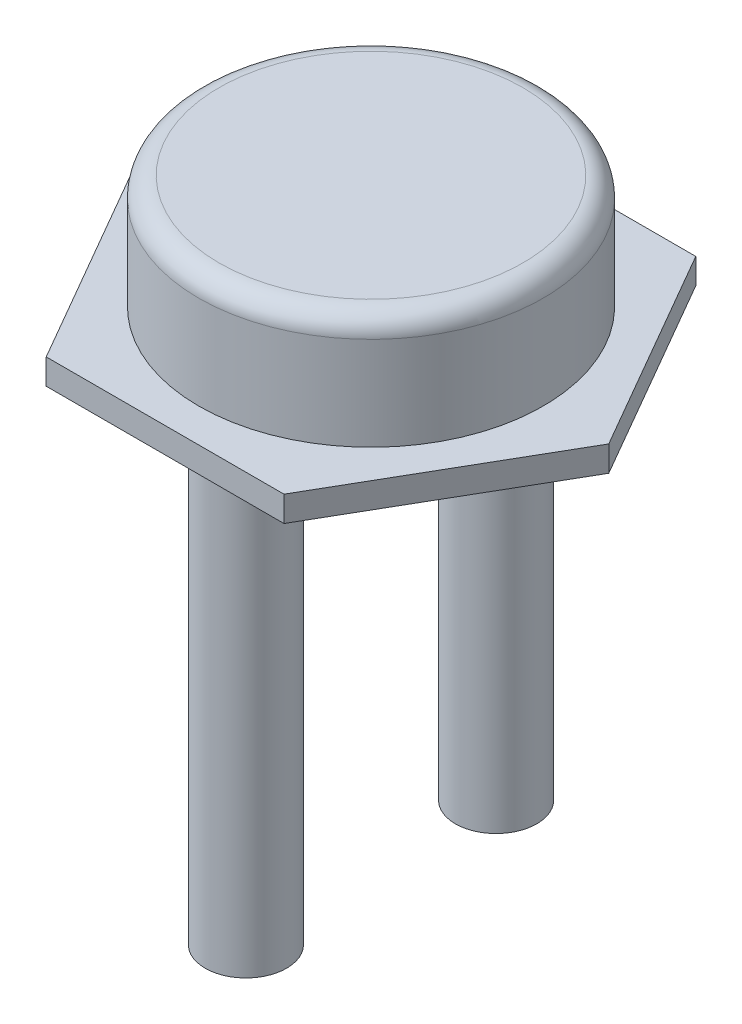
ISO-10303-21;
HEADER;
FILE_DESCRIPTION(('STEP AP214'),'2;1');
FILE_NAME('part.step','',(''),(''),'','','');
FILE_SCHEMA(('AUTOMOTIVE_DESIGN { 1 0 10303 214 1 1 1 1 }'));
ENDSEC;
DATA;
#1=APPLICATION_CONTEXT('core data for automotive mechanical design processes');
#2=APPLICATION_PROTOCOL_DEFINITION('international standard','automotive_design',2000,#1);
#3=PRODUCT_CONTEXT('',#1,'mechanical');
#4=PRODUCT('Part','Part','',(#3));
#5=PRODUCT_RELATED_PRODUCT_CATEGORY('part','',(#4));
#6=PRODUCT_DEFINITION_FORMATION('','',#4);
#7=PRODUCT_DEFINITION_CONTEXT('part definition',#1,'design');
#8=PRODUCT_DEFINITION('design','',#6,#7);
#9=PRODUCT_DEFINITION_SHAPE('','',#8);
#10=(LENGTH_UNIT() NAMED_UNIT(*) SI_UNIT(.MILLI.,.METRE.));
#11=(NAMED_UNIT(*) PLANE_ANGLE_UNIT() SI_UNIT($,.RADIAN.));
#12=(NAMED_UNIT(*) SI_UNIT($,.STERADIAN.) SOLID_ANGLE_UNIT());
#13=UNCERTAINTY_MEASURE_WITH_UNIT(LENGTH_MEASURE(1.E-05),#10,'distance_accuracy_value','');
#14=(GEOMETRIC_REPRESENTATION_CONTEXT(3) GLOBAL_UNCERTAINTY_ASSIGNED_CONTEXT((#13)) GLOBAL_UNIT_ASSIGNED_CONTEXT((#10,
#11,#12)) REPRESENTATION_CONTEXT('',''));
#15=CARTESIAN_POINT('',(0.,0.,0.));
#16=DIRECTION('',(0.,0.,1.));
#17=DIRECTION('',(1.,0.,0.));
#18=AXIS2_PLACEMENT_3D('',#15,#16,#17);
#19=CARTESIAN_POINT('',(0.,7.1,0.));
#20=DIRECTION('',(0.,-1.,0.));
#21=DIRECTION('',(0.,0.,-1.));
#22=AXIS2_PLACEMENT_3D('',#19,#20,#21);
#23=CYLINDRICAL_SURFACE('',#22,10.75);
#24=CARTESIAN_POINT('',(0.,5.83,0.));
#25=DIRECTION('',(0.,1.,0.));
#26=DIRECTION('',(0.,0.,1.));
#27=AXIS2_PLACEMENT_3D('',#24,#25,#26);
#28=CIRCLE('',#27,10.75);
#29=CARTESIAN_POINT('',(0.,5.83,10.75));
#30=VERTEX_POINT('',#29);
#31=EDGE_CURVE('E11',#30,#30,#28,.F.);
#32=ORIENTED_EDGE('',*,*,#31,.T.);
#33=EDGE_LOOP('',(#32));
#34=FACE_BOUND('',#33,.T.);
#35=CARTESIAN_POINT('',(0.,0.,0.));
#36=DIRECTION('',(0.,-1.,0.));
#37=DIRECTION('',(0.,0.,-1.));
#38=AXIS2_PLACEMENT_3D('',#35,#36,#37);
#39=CIRCLE('',#38,10.75);
#40=CARTESIAN_POINT('',(0.,0.,-10.75));
#41=VERTEX_POINT('',#40);
#42=EDGE_CURVE('E142',#41,#41,#39,.T.);
#43=ORIENTED_EDGE('',*,*,#42,.F.);
#44=EDGE_LOOP('',(#43));
#45=FACE_BOUND('',#44,.T.);
#46=ADVANCED_FACE('F36',(#34,#45),#23,.T.);
#47=CARTESIAN_POINT('',(0.,7.1,0.));
#48=DIRECTION('',(0.,1.,0.));
#49=DIRECTION('',(0.,0.,1.));
#50=AXIS2_PLACEMENT_3D('',#47,#48,#49);
#51=PLANE('',#50);
#52=CARTESIAN_POINT('',(0.,7.1,0.));
#53=DIRECTION('',(0.,1.,0.));
#54=DIRECTION('',(0.,0.,1.));
#55=AXIS2_PLACEMENT_3D('',#52,#53,#54);
#56=CIRCLE('',#55,9.48);
#57=CARTESIAN_POINT('',(0.,7.1,9.48));
#58=VERTEX_POINT('',#57);
#59=EDGE_CURVE('E45',#58,#58,#56,.T.);
#60=ORIENTED_EDGE('',*,*,#59,.T.);
#61=EDGE_LOOP('',(#60));
#62=FACE_BOUND('',#61,.T.);
#63=ADVANCED_FACE('F147',(#62),#51,.T.);
#64=CARTESIAN_POINT('',(-7.41895095908669,-1.5875,12.85));
#65=DIRECTION('',(0.866025403784439,0.,-0.5));
#66=DIRECTION('',(-0.5,0.,-0.866025403784439));
#67=AXIS2_PLACEMENT_3D('',#64,#65,#66);
#68=PLANE('',#67);
#69=DIRECTION('',(-0.5,0.,-0.866025403784439));
#70=VECTOR('',#69,1.);
#71=CARTESIAN_POINT('',(-7.41895095908669,0.,12.85));
#72=LINE('',#71,#70);
#73=CARTESIAN_POINT('',(-7.41895095908669,0.,12.85));
#74=VERTEX_POINT('',#73);
#75=CARTESIAN_POINT('',(-14.8379019181734,0.,0.));
#76=VERTEX_POINT('',#75);
#77=EDGE_CURVE('E122',#74,#76,#72,.T.);
#78=ORIENTED_EDGE('',*,*,#77,.T.);
#79=DIRECTION('',(0.,1.,0.));
#80=VECTOR('',#79,1.);
#81=CARTESIAN_POINT('',(-14.8379019181734,-1.5875,0.));
#82=LINE('',#81,#80);
#83=CARTESIAN_POINT('',(-14.8379019181734,-1.5875,0.));
#84=VERTEX_POINT('',#83);
#85=EDGE_CURVE('E140',#84,#76,#82,.T.);
#86=ORIENTED_EDGE('',*,*,#85,.F.);
#87=DIRECTION('',(-0.5,0.,-0.866025403784439));
#88=VECTOR('',#87,1.);
#89=CARTESIAN_POINT('',(-7.41895095908669,-1.5875,12.85));
#90=LINE('',#89,#88);
#91=CARTESIAN_POINT('',(-7.41895095908669,-1.5875,12.85));
#92=VERTEX_POINT('',#91);
#93=EDGE_CURVE('E133',#92,#84,#90,.T.);
#94=ORIENTED_EDGE('',*,*,#93,.F.);
#95=DIRECTION('',(0.,1.,0.));
#96=VECTOR('',#95,1.);
#97=CARTESIAN_POINT('',(-7.41895095908669,-1.5875,12.85));
#98=LINE('',#97,#96);
#99=EDGE_CURVE('E118',#92,#74,#98,.T.);
#100=ORIENTED_EDGE('',*,*,#99,.T.);
#101=EDGE_LOOP('',(#78,#86,#94,#100));
#102=FACE_BOUND('',#101,.T.);
#103=ADVANCED_FACE('F164',(#102),#68,.F.);
#104=CARTESIAN_POINT('',(-14.8379019181734,-1.5875,0.));
#105=DIRECTION('',(0.866025403784439,0.,0.5));
#106=DIRECTION('',(0.5,0.,-0.866025403784439));
#107=AXIS2_PLACEMENT_3D('',#104,#105,#106);
#108=PLANE('',#107);
#109=DIRECTION('',(0.5,0.,-0.866025403784439));
#110=VECTOR('',#109,1.);
#111=CARTESIAN_POINT('',(-14.8379019181734,0.,0.));
#112=LINE('',#111,#110);
#113=CARTESIAN_POINT('',(-7.4189509590867,0.,-12.85));
#114=VERTEX_POINT('',#113);
#115=EDGE_CURVE('E125',#76,#114,#112,.T.);
#116=ORIENTED_EDGE('',*,*,#115,.T.);
#117=DIRECTION('',(0.,1.,0.));
#118=VECTOR('',#117,1.);
#119=CARTESIAN_POINT('',(-7.4189509590867,-1.5875,-12.85));
#120=LINE('',#119,#118);
#121=CARTESIAN_POINT('',(-7.4189509590867,-1.5875,-12.85));
#122=VERTEX_POINT('',#121);
#123=EDGE_CURVE('E137',#122,#114,#120,.T.);
#124=ORIENTED_EDGE('',*,*,#123,.F.);
#125=DIRECTION('',(0.5,0.,-0.866025403784439));
#126=VECTOR('',#125,1.);
#127=CARTESIAN_POINT('',(-14.8379019181734,-1.5875,0.));
#128=LINE('',#127,#126);
#129=EDGE_CURVE('E91',#84,#122,#128,.T.);
#130=ORIENTED_EDGE('',*,*,#129,.F.);
#131=ORIENTED_EDGE('',*,*,#85,.T.);
#132=EDGE_LOOP('',(#116,#124,#130,#131));
#133=FACE_BOUND('',#132,.T.);
#134=ADVANCED_FACE('F170',(#133),#108,.F.);
#135=CARTESIAN_POINT('',(-7.4189509590867,-1.5875,-12.85));
#136=DIRECTION('',(0.,0.,1.));
#137=DIRECTION('',(1.,0.,0.));
#138=AXIS2_PLACEMENT_3D('',#135,#136,#137);
#139=PLANE('',#138);
#140=DIRECTION('',(1.,0.,0.));
#141=VECTOR('',#140,1.);
#142=CARTESIAN_POINT('',(-7.4189509590867,0.,-12.85));
#143=LINE('',#142,#141);
#144=CARTESIAN_POINT('',(7.41895095908669,0.,-12.85));
#145=VERTEX_POINT('',#144);
#146=EDGE_CURVE('E128',#114,#145,#143,.T.);
#147=ORIENTED_EDGE('',*,*,#146,.T.);
#148=DIRECTION('',(0.,1.,0.));
#149=VECTOR('',#148,1.);
#150=CARTESIAN_POINT('',(7.41895095908669,-1.5875,-12.85));
#151=LINE('',#150,#149);
#152=CARTESIAN_POINT('',(7.41895095908669,-1.5875,-12.85));
#153=VERTEX_POINT('',#152);
#154=EDGE_CURVE('E113',#153,#145,#151,.T.);
#155=ORIENTED_EDGE('',*,*,#154,.F.);
#156=DIRECTION('',(1.,0.,0.));
#157=VECTOR('',#156,1.);
#158=CARTESIAN_POINT('',(-7.4189509590867,-1.5875,-12.85));
#159=LINE('',#158,#157);
#160=EDGE_CURVE('E104',#122,#153,#159,.T.);
#161=ORIENTED_EDGE('',*,*,#160,.F.);
#162=ORIENTED_EDGE('',*,*,#123,.T.);
#163=EDGE_LOOP('',(#147,#155,#161,#162));
#164=FACE_BOUND('',#163,.T.);
#165=ADVANCED_FACE('F174',(#164),#139,.F.);
#166=CARTESIAN_POINT('',(7.41895095908669,-1.5875,-12.85));
#167=DIRECTION('',(-0.866025403784439,0.,0.5));
#168=DIRECTION('',(0.5,0.,0.866025403784439));
#169=AXIS2_PLACEMENT_3D('',#166,#167,#168);
#170=PLANE('',#169);
#171=DIRECTION('',(0.5,0.,0.866025403784439));
#172=VECTOR('',#171,1.);
#173=CARTESIAN_POINT('',(7.41895095908669,0.,-12.85));
#174=LINE('',#173,#172);
#175=CARTESIAN_POINT('',(14.8379019181734,0.,0.));
#176=VERTEX_POINT('',#175);
#177=EDGE_CURVE('E112',#145,#176,#174,.T.);
#178=ORIENTED_EDGE('',*,*,#177,.T.);
#179=DIRECTION('',(0.,1.,0.));
#180=VECTOR('',#179,1.);
#181=CARTESIAN_POINT('',(14.8379019181734,-1.5875,0.));
#182=LINE('',#181,#180);
#183=CARTESIAN_POINT('',(14.8379019181734,-1.5875,0.));
#184=VERTEX_POINT('',#183);
#185=EDGE_CURVE('E109',#184,#176,#182,.T.);
#186=ORIENTED_EDGE('',*,*,#185,.F.);
#187=DIRECTION('',(0.5,0.,0.866025403784439));
#188=VECTOR('',#187,1.);
#189=CARTESIAN_POINT('',(7.41895095908669,-1.5875,-12.85));
#190=LINE('',#189,#188);
#191=EDGE_CURVE('E98',#153,#184,#190,.T.);
#192=ORIENTED_EDGE('',*,*,#191,.F.);
#193=ORIENTED_EDGE('',*,*,#154,.T.);
#194=EDGE_LOOP('',(#178,#186,#192,#193));
#195=FACE_BOUND('',#194,.T.);
#196=ADVANCED_FACE('F110',(#195),#170,.F.);
#197=CARTESIAN_POINT('',(14.8379019181734,-1.5875,0.));
#198=DIRECTION('',(-0.866025403784439,0.,-0.5));
#199=DIRECTION('',(-0.5,0.,0.866025403784439));
#200=AXIS2_PLACEMENT_3D('',#197,#198,#199);
#201=PLANE('',#200);
#202=DIRECTION('',(-0.5,0.,0.866025403784439));
#203=VECTOR('',#202,1.);
#204=CARTESIAN_POINT('',(14.8379019181734,0.,0.));
#205=LINE('',#204,#203);
#206=CARTESIAN_POINT('',(7.4189509590867,0.,12.85));
#207=VERTEX_POINT('',#206);
#208=EDGE_CURVE('E76',#176,#207,#205,.T.);
#209=ORIENTED_EDGE('',*,*,#208,.T.);
#210=DIRECTION('',(0.,1.,0.));
#211=VECTOR('',#210,1.);
#212=CARTESIAN_POINT('',(7.4189509590867,-1.5875,12.85));
#213=LINE('',#212,#211);
#214=CARTESIAN_POINT('',(7.4189509590867,-1.5875,12.85));
#215=VERTEX_POINT('',#214);
#216=EDGE_CURVE('E114',#215,#207,#213,.T.);
#217=ORIENTED_EDGE('',*,*,#216,.F.);
#218=DIRECTION('',(-0.5,0.,0.866025403784439));
#219=VECTOR('',#218,1.);
#220=CARTESIAN_POINT('',(14.8379019181734,-1.5875,0.));
#221=LINE('',#220,#219);
#222=EDGE_CURVE('E102',#184,#215,#221,.T.);
#223=ORIENTED_EDGE('',*,*,#222,.F.);
#224=ORIENTED_EDGE('',*,*,#185,.T.);
#225=EDGE_LOOP('',(#209,#217,#223,#224));
#226=FACE_BOUND('',#225,.T.);
#227=ADVANCED_FACE('F116',(#226),#201,.F.);
#228=CARTESIAN_POINT('',(7.4189509590867,-1.5875,12.85));
#229=DIRECTION('',(0.,0.,-1.));
#230=DIRECTION('',(-1.,0.,0.));
#231=AXIS2_PLACEMENT_3D('',#228,#229,#230);
#232=PLANE('',#231);
#233=DIRECTION('',(-1.,0.,0.));
#234=VECTOR('',#233,1.);
#235=CARTESIAN_POINT('',(7.4189509590867,0.,12.85));
#236=LINE('',#235,#234);
#237=EDGE_CURVE('E82',#207,#74,#236,.T.);
#238=ORIENTED_EDGE('',*,*,#237,.T.);
#239=ORIENTED_EDGE('',*,*,#99,.F.);
#240=DIRECTION('',(-1.,0.,0.));
#241=VECTOR('',#240,1.);
#242=CARTESIAN_POINT('',(7.4189509590867,-1.5875,12.85));
#243=LINE('',#242,#241);
#244=EDGE_CURVE('E53',#215,#92,#243,.T.);
#245=ORIENTED_EDGE('',*,*,#244,.F.);
#246=ORIENTED_EDGE('',*,*,#216,.T.);
#247=EDGE_LOOP('',(#238,#239,#245,#246));
#248=FACE_BOUND('',#247,.T.);
#249=ADVANCED_FACE('F182',(#248),#232,.F.);
#250=CARTESIAN_POINT('',(0.,-1.5875,0.));
#251=DIRECTION('',(0.,-1.,0.));
#252=DIRECTION('',(0.,0.,-1.));
#253=AXIS2_PLACEMENT_3D('',#250,#251,#252);
#254=PLANE('',#253);
#255=CARTESIAN_POINT('',(0.,-1.5875,-7.80660502960036));
#256=DIRECTION('',(0.,-1.,0.));
#257=DIRECTION('',(0.,0.,-1.));
#258=AXIS2_PLACEMENT_3D('',#255,#256,#257);
#259=CIRCLE('',#258,2.54);
#260=CARTESIAN_POINT('',(0.,-1.5875,-5.26660502960036));
#261=VERTEX_POINT('',#260);
#262=EDGE_CURVE('E210',#261,#261,#259,.T.);
#263=ORIENTED_EDGE('',*,*,#262,.F.);
#264=EDGE_LOOP('',(#263));
#265=FACE_BOUND('',#264,.T.);
#266=CARTESIAN_POINT('',(0.,-1.5875,7.80660502960036));
#267=DIRECTION('',(0.,-1.,0.));
#268=DIRECTION('',(0.,0.,-1.));
#269=AXIS2_PLACEMENT_3D('',#266,#267,#268);
#270=CIRCLE('',#269,2.54);
#271=CARTESIAN_POINT('',(0.,-1.5875,10.3466050296004));
#272=VERTEX_POINT('',#271);
#273=EDGE_CURVE('E212',#272,#272,#270,.T.);
#274=ORIENTED_EDGE('',*,*,#273,.F.);
#275=EDGE_LOOP('',(#274));
#276=FACE_BOUND('',#275,.T.);
#277=ORIENTED_EDGE('',*,*,#93,.T.);
#278=ORIENTED_EDGE('',*,*,#129,.T.);
#279=ORIENTED_EDGE('',*,*,#160,.T.);
#280=ORIENTED_EDGE('',*,*,#191,.T.);
#281=ORIENTED_EDGE('',*,*,#222,.T.);
#282=ORIENTED_EDGE('',*,*,#244,.T.);
#283=EDGE_LOOP('',(#277,#278,#279,#280,#281,#282));
#284=FACE_BOUND('',#283,.T.);
#285=ADVANCED_FACE('F100',(#265,#276,#284),#254,.T.);
#286=CARTESIAN_POINT('',(0.,0.,0.));
#287=DIRECTION('',(0.,-1.,0.));
#288=DIRECTION('',(0.,0.,-1.));
#289=AXIS2_PLACEMENT_3D('',#286,#287,#288);
#290=PLANE('',#289);
#291=ORIENTED_EDGE('',*,*,#42,.T.);
#292=EDGE_LOOP('',(#291));
#293=FACE_BOUND('',#292,.T.);
#294=ORIENTED_EDGE('',*,*,#77,.F.);
#295=ORIENTED_EDGE('',*,*,#237,.F.);
#296=ORIENTED_EDGE('',*,*,#208,.F.);
#297=ORIENTED_EDGE('',*,*,#177,.F.);
#298=ORIENTED_EDGE('',*,*,#146,.F.);
#299=ORIENTED_EDGE('',*,*,#115,.F.);
#300=EDGE_LOOP('',(#294,#295,#296,#297,#298,#299));
#301=FACE_BOUND('',#300,.T.);
#302=ADVANCED_FACE('F185',(#293,#301),#290,.F.);
#303=CARTESIAN_POINT('',(0.,-30.5875,7.80660502960036));
#304=DIRECTION('',(0.,1.,0.));
#305=DIRECTION('',(0.,0.,1.));
#306=AXIS2_PLACEMENT_3D('',#303,#304,#305);
#307=CYLINDRICAL_SURFACE('',#306,2.54);
#308=CARTESIAN_POINT('',(0.,-30.5875,7.80660502960036));
#309=DIRECTION('',(0.,-1.,0.));
#310=DIRECTION('',(0.,0.,-1.));
#311=AXIS2_PLACEMENT_3D('',#308,#309,#310);
#312=CIRCLE('',#311,2.54);
#313=CARTESIAN_POINT('',(0.,-30.5875,10.3466050296004));
#314=VERTEX_POINT('',#313);
#315=EDGE_CURVE('E126',#314,#314,#312,.T.);
#316=CARTESIAN_POINT('',(0.,-30.5875,10.3466050296004));
#317=CARTESIAN_POINT('',(0.,-30.2854166666667,10.3466050296004));
#318=CARTESIAN_POINT('',(0.,-29.9833333333333,10.3466050296004));
#319=CARTESIAN_POINT('',(0.,-29.3791666666667,10.3466050296004));
#320=CARTESIAN_POINT('',(0.,-29.0770833333333,10.3466050296004));
#321=CARTESIAN_POINT('',(0.,-28.4729166666667,10.3466050296004));
#322=CARTESIAN_POINT('',(0.,-28.1708333333333,10.3466050296004));
#323=CARTESIAN_POINT('',(0.,-27.5666666666667,10.3466050296004));
#324=CARTESIAN_POINT('',(0.,-27.2645833333333,10.3466050296004));
#325=CARTESIAN_POINT('',(0.,-26.6604166666667,10.3466050296004));
#326=CARTESIAN_POINT('',(0.,-26.3583333333333,10.3466050296004));
#327=CARTESIAN_POINT('',(0.,-25.7541666666667,10.3466050296004));
#328=CARTESIAN_POINT('',(0.,-25.4520833333333,10.3466050296004));
#329=CARTESIAN_POINT('',(0.,-24.8479166666667,10.3466050296004));
#330=CARTESIAN_POINT('',(0.,-24.5458333333333,10.3466050296004));
#331=CARTESIAN_POINT('',(0.,-23.9416666666667,10.3466050296004));
#332=CARTESIAN_POINT('',(0.,-23.6395833333333,10.3466050296004));
#333=CARTESIAN_POINT('',(0.,-23.0354166666667,10.3466050296004));
#334=CARTESIAN_POINT('',(0.,-22.7333333333333,10.3466050296004));
#335=CARTESIAN_POINT('',(0.,-22.1291666666667,10.3466050296004));
#336=CARTESIAN_POINT('',(0.,-21.8270833333333,10.3466050296004));
#337=CARTESIAN_POINT('',(0.,-21.2229166666667,10.3466050296004));
#338=CARTESIAN_POINT('',(0.,-20.9208333333333,10.3466050296004));
#339=CARTESIAN_POINT('',(0.,-20.3166666666667,10.3466050296004));
#340=CARTESIAN_POINT('',(0.,-20.0145833333333,10.3466050296004));
#341=CARTESIAN_POINT('',(0.,-19.4104166666667,10.3466050296004));
#342=CARTESIAN_POINT('',(0.,-19.1083333333333,10.3466050296004));
#343=CARTESIAN_POINT('',(0.,-18.5041666666667,10.3466050296004));
#344=CARTESIAN_POINT('',(0.,-18.2020833333333,10.3466050296004));
#345=CARTESIAN_POINT('',(0.,-17.5979166666667,10.3466050296004));
#346=CARTESIAN_POINT('',(0.,-17.2958333333333,10.3466050296004));
#347=CARTESIAN_POINT('',(0.,-16.6916666666667,10.3466050296004));
#348=CARTESIAN_POINT('',(0.,-16.3895833333333,10.3466050296004));
#349=CARTESIAN_POINT('',(0.,-15.7854166666667,10.3466050296004));
#350=CARTESIAN_POINT('',(0.,-15.4833333333333,10.3466050296004));
#351=CARTESIAN_POINT('',(0.,-14.8791666666667,10.3466050296004));
#352=CARTESIAN_POINT('',(0.,-14.5770833333333,10.3466050296004));
#353=CARTESIAN_POINT('',(0.,-13.9729166666667,10.3466050296004));
#354=CARTESIAN_POINT('',(0.,-13.6708333333333,10.3466050296004));
#355=CARTESIAN_POINT('',(0.,-13.0666666666667,10.3466050296004));
#356=CARTESIAN_POINT('',(0.,-12.7645833333333,10.3466050296004));
#357=CARTESIAN_POINT('',(0.,-12.1604166666667,10.3466050296004));
#358=CARTESIAN_POINT('',(0.,-11.8583333333333,10.3466050296004));
#359=CARTESIAN_POINT('',(0.,-11.2541666666667,10.3466050296004));
#360=CARTESIAN_POINT('',(0.,-10.9520833333333,10.3466050296004));
#361=CARTESIAN_POINT('',(0.,-10.3479166666667,10.3466050296004));
#362=CARTESIAN_POINT('',(0.,-10.0458333333333,10.3466050296004));
#363=CARTESIAN_POINT('',(0.,-9.44166666666667,10.3466050296004));
#364=CARTESIAN_POINT('',(0.,-9.13958333333333,10.3466050296004));
#365=CARTESIAN_POINT('',(0.,-8.53541666666666,10.3466050296004));
#366=CARTESIAN_POINT('',(0.,-8.23333333333333,10.3466050296004));
#367=CARTESIAN_POINT('',(0.,-7.62916666666667,10.3466050296004));
#368=CARTESIAN_POINT('',(0.,-7.32708333333333,10.3466050296004));
#369=CARTESIAN_POINT('',(0.,-6.72291666666667,10.3466050296004));
#370=CARTESIAN_POINT('',(0.,-6.42083333333333,10.3466050296004));
#371=CARTESIAN_POINT('',(0.,-5.81666666666667,10.3466050296004));
#372=CARTESIAN_POINT('',(0.,-5.51458333333333,10.3466050296004));
#373=CARTESIAN_POINT('',(0.,-4.91041666666666,10.3466050296004));
#374=CARTESIAN_POINT('',(0.,-4.60833333333333,10.3466050296004));
#375=CARTESIAN_POINT('',(0.,-4.00416666666667,10.3466050296004));
#376=CARTESIAN_POINT('',(0.,-3.70208333333333,10.3466050296004));
#377=CARTESIAN_POINT('',(0.,-3.09791666666667,10.3466050296004));
#378=CARTESIAN_POINT('',(0.,-2.79583333333333,10.3466050296004));
#379=CARTESIAN_POINT('',(0.,-2.19166666666667,10.3466050296004));
#380=CARTESIAN_POINT('',(0.,-1.88958333333333,10.3466050296004));
#381=CARTESIAN_POINT('',(0.,-1.5875,10.3466050296004));
#382=B_SPLINE_CURVE_WITH_KNOTS('',3,(#316,#317,#318,#319,#320,#321,#322,#323,#324,#325,#326,
#327,#328,#329,#330,#331,#332,#333,#334,#335,#336,#337,#338,#339,#340,#341,#342,#343,#344,#345,
#346,#347,#348,#349,#350,#351,#352,#353,#354,#355,#356,#357,#358,#359,#360,#361,#362,#363,#364,
#365,#366,#367,#368,#369,#370,#371,#372,#373,#374,#375,#376,#377,#378,#379,#380,#381),
.UNSPECIFIED.,.F.,.F.,(4,2,2,2,2,2,2,2,2,2,2,2,2,2,2,2,2,2,2,2,2,2,2,2,2,2,2,2,2,2,2,2,4),(0.,
0.906249999999997,1.8125,2.71875,3.625,4.53125,5.4375,6.34375,7.25,8.15625,9.0625,9.96875,
10.875,11.78125,12.6875,13.59375,14.5,15.40625,16.3125,17.21875,18.125,19.03125,19.9375,
20.84375,21.75,22.65625,23.5625,24.46875,25.375,26.28125,27.1875,28.09375,29.),.UNSPECIFIED.);
#383=EDGE_CURVE('BSEAM188',#314,#272,#382,.T.);
#384=ORIENTED_EDGE('',*,*,#315,.F.);
#385=ORIENTED_EDGE('',*,*,#273,.T.);
#386=ORIENTED_EDGE('',*,*,#383,.T.);
#387=ORIENTED_EDGE('',*,*,#383,.F.);
#388=EDGE_LOOP('',(#384,#386,#385,#387));
#389=FACE_BOUND('',#388,.T.);
#390=ADVANCED_FACE('F188',(#389),#307,.T.);
#391=CARTESIAN_POINT('',(0.,-30.5875,7.80660502960036));
#392=DIRECTION('',(0.,-1.,0.));
#393=DIRECTION('',(0.,0.,-1.));
#394=AXIS2_PLACEMENT_3D('',#391,#392,#393);
#395=PLANE('',#394);
#396=ORIENTED_EDGE('',*,*,#315,.T.);
#397=EDGE_LOOP('',(#396));
#398=FACE_BOUND('',#397,.T.);
#399=ADVANCED_FACE('F195',(#398),#395,.T.);
#400=CARTESIAN_POINT('',(0.,-30.5875,-7.80660502960036));
#401=DIRECTION('',(0.,1.,0.));
#402=DIRECTION('',(0.,0.,1.));
#403=AXIS2_PLACEMENT_3D('',#400,#401,#402);
#404=CYLINDRICAL_SURFACE('',#403,2.54);
#405=CARTESIAN_POINT('',(0.,-30.5875,-7.80660502960036));
#406=DIRECTION('',(0.,-1.,0.));
#407=DIRECTION('',(0.,0.,-1.));
#408=AXIS2_PLACEMENT_3D('',#405,#406,#407);
#409=CIRCLE('',#408,2.54);
#410=CARTESIAN_POINT('',(0.,-30.5875,-5.26660502960036));
#411=VERTEX_POINT('',#410);
#412=EDGE_CURVE('E207',#411,#411,#409,.T.);
#413=CARTESIAN_POINT('',(0.,-30.5875,-5.26660502960036));
#414=CARTESIAN_POINT('',(0.,-30.2854166666667,-5.26660502960036));
#415=CARTESIAN_POINT('',(0.,-29.9833333333333,-5.26660502960036));
#416=CARTESIAN_POINT('',(0.,-29.3791666666667,-5.26660502960036));
#417=CARTESIAN_POINT('',(0.,-29.0770833333333,-5.26660502960036));
#418=CARTESIAN_POINT('',(0.,-28.4729166666667,-5.26660502960036));
#419=CARTESIAN_POINT('',(0.,-28.1708333333333,-5.26660502960036));
#420=CARTESIAN_POINT('',(0.,-27.5666666666667,-5.26660502960036));
#421=CARTESIAN_POINT('',(0.,-27.2645833333333,-5.26660502960036));
#422=CARTESIAN_POINT('',(0.,-26.6604166666667,-5.26660502960036));
#423=CARTESIAN_POINT('',(0.,-26.3583333333333,-5.26660502960036));
#424=CARTESIAN_POINT('',(0.,-25.7541666666667,-5.26660502960036));
#425=CARTESIAN_POINT('',(0.,-25.4520833333333,-5.26660502960036));
#426=CARTESIAN_POINT('',(0.,-24.8479166666667,-5.26660502960036));
#427=CARTESIAN_POINT('',(0.,-24.5458333333333,-5.26660502960036));
#428=CARTESIAN_POINT('',(0.,-23.9416666666667,-5.26660502960036));
#429=CARTESIAN_POINT('',(0.,-23.6395833333333,-5.26660502960036));
#430=CARTESIAN_POINT('',(0.,-23.0354166666667,-5.26660502960036));
#431=CARTESIAN_POINT('',(0.,-22.7333333333333,-5.26660502960036));
#432=CARTESIAN_POINT('',(0.,-22.1291666666667,-5.26660502960036));
#433=CARTESIAN_POINT('',(0.,-21.8270833333333,-5.26660502960036));
#434=CARTESIAN_POINT('',(0.,-21.2229166666667,-5.26660502960036));
#435=CARTESIAN_POINT('',(0.,-20.9208333333333,-5.26660502960036));
#436=CARTESIAN_POINT('',(0.,-20.3166666666667,-5.26660502960036));
#437=CARTESIAN_POINT('',(0.,-20.0145833333333,-5.26660502960036));
#438=CARTESIAN_POINT('',(0.,-19.4104166666667,-5.26660502960036));
#439=CARTESIAN_POINT('',(0.,-19.1083333333333,-5.26660502960036));
#440=CARTESIAN_POINT('',(0.,-18.5041666666667,-5.26660502960036));
#441=CARTESIAN_POINT('',(0.,-18.2020833333333,-5.26660502960036));
#442=CARTESIAN_POINT('',(0.,-17.5979166666667,-5.26660502960036));
#443=CARTESIAN_POINT('',(0.,-17.2958333333333,-5.26660502960036));
#444=CARTESIAN_POINT('',(0.,-16.6916666666667,-5.26660502960036));
#445=CARTESIAN_POINT('',(0.,-16.3895833333333,-5.26660502960036));
#446=CARTESIAN_POINT('',(0.,-15.7854166666667,-5.26660502960036));
#447=CARTESIAN_POINT('',(0.,-15.4833333333333,-5.26660502960036));
#448=CARTESIAN_POINT('',(0.,-14.8791666666667,-5.26660502960036));
#449=CARTESIAN_POINT('',(0.,-14.5770833333333,-5.26660502960036));
#450=CARTESIAN_POINT('',(0.,-13.9729166666667,-5.26660502960036));
#451=CARTESIAN_POINT('',(0.,-13.6708333333333,-5.26660502960036));
#452=CARTESIAN_POINT('',(0.,-13.0666666666667,-5.26660502960036));
#453=CARTESIAN_POINT('',(0.,-12.7645833333333,-5.26660502960036));
#454=CARTESIAN_POINT('',(0.,-12.1604166666667,-5.26660502960036));
#455=CARTESIAN_POINT('',(0.,-11.8583333333333,-5.26660502960036));
#456=CARTESIAN_POINT('',(0.,-11.2541666666667,-5.26660502960036));
#457=CARTESIAN_POINT('',(0.,-10.9520833333333,-5.26660502960036));
#458=CARTESIAN_POINT('',(0.,-10.3479166666667,-5.26660502960036));
#459=CARTESIAN_POINT('',(0.,-10.0458333333333,-5.26660502960036));
#460=CARTESIAN_POINT('',(0.,-9.44166666666667,-5.26660502960036));
#461=CARTESIAN_POINT('',(0.,-9.13958333333333,-5.26660502960036));
#462=CARTESIAN_POINT('',(0.,-8.53541666666666,-5.26660502960036));
#463=CARTESIAN_POINT('',(0.,-8.23333333333333,-5.26660502960036));
#464=CARTESIAN_POINT('',(0.,-7.62916666666667,-5.26660502960036));
#465=CARTESIAN_POINT('',(0.,-7.32708333333333,-5.26660502960036));
#466=CARTESIAN_POINT('',(0.,-6.72291666666667,-5.26660502960036));
#467=CARTESIAN_POINT('',(0.,-6.42083333333333,-5.26660502960036));
#468=CARTESIAN_POINT('',(0.,-5.81666666666667,-5.26660502960036));
#469=CARTESIAN_POINT('',(0.,-5.51458333333333,-5.26660502960036));
#470=CARTESIAN_POINT('',(0.,-4.91041666666666,-5.26660502960036));
#471=CARTESIAN_POINT('',(0.,-4.60833333333333,-5.26660502960036));
#472=CARTESIAN_POINT('',(0.,-4.00416666666667,-5.26660502960036));
#473=CARTESIAN_POINT('',(0.,-3.70208333333333,-5.26660502960036));
#474=CARTESIAN_POINT('',(0.,-3.09791666666667,-5.26660502960036));
#475=CARTESIAN_POINT('',(0.,-2.79583333333333,-5.26660502960036));
#476=CARTESIAN_POINT('',(0.,-2.19166666666667,-5.26660502960036));
#477=CARTESIAN_POINT('',(0.,-1.88958333333333,-5.26660502960036));
#478=CARTESIAN_POINT('',(0.,-1.5875,-5.26660502960036));
#479=B_SPLINE_CURVE_WITH_KNOTS('',3,(#413,#414,#415,#416,#417,#418,#419,#420,#421,#422,#423,
#424,#425,#426,#427,#428,#429,#430,#431,#432,#433,#434,#435,#436,#437,#438,#439,#440,#441,#442,
#443,#444,#445,#446,#447,#448,#449,#450,#451,#452,#453,#454,#455,#456,#457,#458,#459,#460,#461,
#462,#463,#464,#465,#466,#467,#468,#469,#470,#471,#472,#473,#474,#475,#476,#477,#478),
.UNSPECIFIED.,.F.,.F.,(4,2,2,2,2,2,2,2,2,2,2,2,2,2,2,2,2,2,2,2,2,2,2,2,2,2,2,2,2,2,2,2,4),(0.,
0.906249999999997,1.8125,2.71875,3.625,4.53125,5.4375,6.34375,7.25,8.15625,9.0625,9.96875,
10.875,11.78125,12.6875,13.59375,14.5,15.40625,16.3125,17.21875,18.125,19.03125,19.9375,
20.84375,21.75,22.65625,23.5625,24.46875,25.375,26.28125,27.1875,28.09375,29.),.UNSPECIFIED.);
#480=EDGE_CURVE('BSEAM155',#411,#261,#479,.T.);
#481=ORIENTED_EDGE('',*,*,#412,.F.);
#482=ORIENTED_EDGE('',*,*,#262,.T.);
#483=ORIENTED_EDGE('',*,*,#480,.T.);
#484=ORIENTED_EDGE('',*,*,#480,.F.);
#485=EDGE_LOOP('',(#481,#483,#482,#484));
#486=FACE_BOUND('',#485,.T.);
#487=ADVANCED_FACE('F155',(#486),#404,.T.);
#488=CARTESIAN_POINT('',(0.,-30.5875,-7.80660502960036));
#489=DIRECTION('',(0.,-1.,0.));
#490=DIRECTION('',(0.,0.,-1.));
#491=AXIS2_PLACEMENT_3D('',#488,#489,#490);
#492=PLANE('',#491);
#493=ORIENTED_EDGE('',*,*,#412,.T.);
#494=EDGE_LOOP('',(#493));
#495=FACE_BOUND('',#494,.T.);
#496=ADVANCED_FACE('F150',(#495),#492,.T.);
#497=CARTESIAN_POINT('',(0.,5.83,0.));
#498=DIRECTION('',(0.,1.,0.));
#499=DIRECTION('',(0.,0.,1.));
#500=AXIS2_PLACEMENT_3D('',#497,#498,#499);
#501=TOROIDAL_SURFACE('',#500,9.48,1.27);
#502=ORIENTED_EDGE('',*,*,#31,.F.);
#503=EDGE_LOOP('',(#502));
#504=FACE_BOUND('',#503,.T.);
#505=ORIENTED_EDGE('',*,*,#59,.F.);
#506=EDGE_LOOP('',(#505));
#507=FACE_BOUND('',#506,.T.);
#508=ADVANCED_FACE('F38',(#504,#507),#501,.T.);
#509=CLOSED_SHELL('',(#46,#63,#103,#134,#165,#196,#227,#249,#285,#302,#390,#399,#487,#496,#508));
#510=MANIFOLD_SOLID_BREP('B2',#509);
#511=ADVANCED_BREP_SHAPE_REPRESENTATION('',(#18,#510),#14);
#512=SHAPE_DEFINITION_REPRESENTATION(#9,#511);
ENDSEC;
END-ISO-10303-21;
